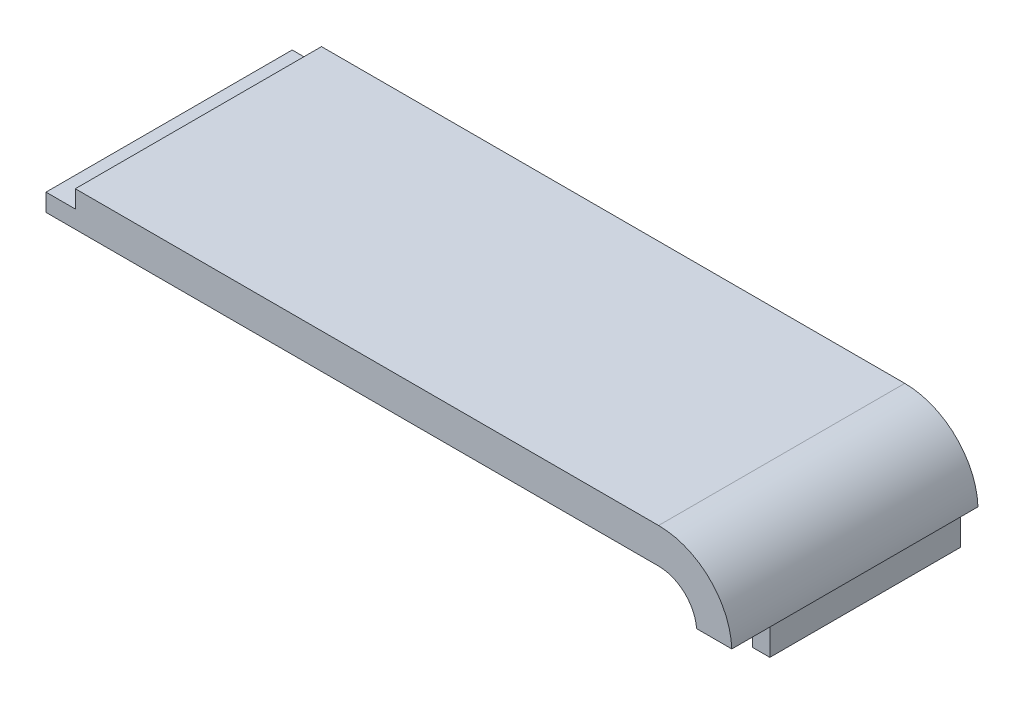
ISO-10303-21;
HEADER;
FILE_DESCRIPTION(('STEP AP214'),'2;1');
FILE_NAME('part.step','',(''),(''),'','','');
FILE_SCHEMA(('AUTOMOTIVE_DESIGN { 1 0 10303 214 1 1 1 1 }'));
ENDSEC;
DATA;
#1=APPLICATION_CONTEXT('core data for automotive mechanical design processes');
#2=APPLICATION_PROTOCOL_DEFINITION('international standard','automotive_design',2000,#1);
#3=PRODUCT_CONTEXT('',#1,'mechanical');
#4=PRODUCT('Part','Part','',(#3));
#5=PRODUCT_RELATED_PRODUCT_CATEGORY('part','',(#4));
#6=PRODUCT_DEFINITION_FORMATION('','',#4);
#7=PRODUCT_DEFINITION_CONTEXT('part definition',#1,'design');
#8=PRODUCT_DEFINITION('design','',#6,#7);
#9=PRODUCT_DEFINITION_SHAPE('','',#8);
#10=(LENGTH_UNIT() NAMED_UNIT(*) SI_UNIT(.MILLI.,.METRE.));
#11=(NAMED_UNIT(*) PLANE_ANGLE_UNIT() SI_UNIT($,.RADIAN.));
#12=(NAMED_UNIT(*) SI_UNIT($,.STERADIAN.) SOLID_ANGLE_UNIT());
#13=UNCERTAINTY_MEASURE_WITH_UNIT(LENGTH_MEASURE(1.E-05),#10,'distance_accuracy_value','');
#14=(GEOMETRIC_REPRESENTATION_CONTEXT(3) GLOBAL_UNCERTAINTY_ASSIGNED_CONTEXT((#13)) GLOBAL_UNIT_ASSIGNED_CONTEXT((#10,
#11,#12)) REPRESENTATION_CONTEXT('',''));
#15=CARTESIAN_POINT('',(0.,0.,0.));
#16=DIRECTION('',(0.,0.,1.));
#17=DIRECTION('',(1.,0.,0.));
#18=AXIS2_PLACEMENT_3D('',#15,#16,#17);
#19=CARTESIAN_POINT('',(21.5136790206361,3.62419354838709,16.8));
#20=DIRECTION('',(0.,1.,0.));
#21=DIRECTION('',(0.,0.,1.));
#22=AXIS2_PLACEMENT_3D('',#19,#20,#21);
#23=PLANE('',#22);
#24=DIRECTION('',(0.,0.,-1.));
#25=VECTOR('',#24,1.);
#26=CARTESIAN_POINT('',(18.1059752999993,3.62419354838709,2.));
#27=LINE('',#26,#25);
#28=CARTESIAN_POINT('',(18.1059752999993,3.62419354838709,2.));
#29=VERTEX_POINT('',#28);
#30=CARTESIAN_POINT('',(18.1059752999993,3.62419354838709,0.));
#31=VERTEX_POINT('',#30);
#32=EDGE_CURVE('E149',#29,#31,#27,.T.);
#33=ORIENTED_EDGE('',*,*,#32,.F.);
#34=DIRECTION('',(1.,0.,0.));
#35=VECTOR('',#34,1.);
#36=CARTESIAN_POINT('',(18.1059752999993,3.62419354838709,2.));
#37=LINE('',#36,#35);
#38=CARTESIAN_POINT('',(21.5136790206361,3.62419354838709,2.));
#39=VERTEX_POINT('',#38);
#40=EDGE_CURVE('E153',#29,#39,#37,.T.);
#41=ORIENTED_EDGE('',*,*,#40,.T.);
#42=DIRECTION('',(0.,0.,-1.));
#43=VECTOR('',#42,1.);
#44=CARTESIAN_POINT('',(21.5136790206361,3.62419354838709,16.8));
#45=LINE('',#44,#43);
#46=CARTESIAN_POINT('',(21.5136790206361,3.62419354838709,16.8));
#47=VERTEX_POINT('',#46);
#48=EDGE_CURVE('E230',#47,#39,#45,.T.);
#49=ORIENTED_EDGE('',*,*,#48,.F.);
#50=DIRECTION('',(1.,0.,0.));
#51=VECTOR('',#50,1.);
#52=CARTESIAN_POINT('',(21.5136790206361,3.62419354838709,16.8));
#53=LINE('',#52,#51);
#54=CARTESIAN_POINT('',(-20.2903225806451,3.62419354838709,16.8));
#55=VERTEX_POINT('',#54);
#56=EDGE_CURVE('E221',#55,#47,#53,.T.);
#57=ORIENTED_EDGE('',*,*,#56,.F.);
#58=DIRECTION('',(0.,0.,1.));
#59=VECTOR('',#58,1.);
#60=CARTESIAN_POINT('',(-20.2903225806451,3.62419354838709,0.));
#61=LINE('',#60,#59);
#62=CARTESIAN_POINT('',(-20.2903225806451,3.62419354838709,0.));
#63=VERTEX_POINT('',#62);
#64=EDGE_CURVE('E177',#63,#55,#61,.T.);
#65=ORIENTED_EDGE('',*,*,#64,.F.);
#66=DIRECTION('',(1.,0.,0.));
#67=VECTOR('',#66,1.);
#68=CARTESIAN_POINT('',(21.5136790206361,3.62419354838709,0.));
#69=LINE('',#68,#67);
#70=EDGE_CURVE('E163',#63,#31,#69,.T.);
#71=ORIENTED_EDGE('',*,*,#70,.T.);
#72=EDGE_LOOP('',(#33,#41,#49,#57,#65,#71));
#73=FACE_BOUND('',#72,.T.);
#74=ADVANCED_FACE('F39',(#73),#23,.F.);
#75=CARTESIAN_POINT('',(-18.2903225806451,6.02419354838709,16.8));
#76=DIRECTION('',(1.,0.,0.));
#77=DIRECTION('',(0.,0.,-1.));
#78=AXIS2_PLACEMENT_3D('',#75,#76,#77);
#79=PLANE('',#78);
#80=DIRECTION('',(0.,0.,-1.));
#81=VECTOR('',#80,1.);
#82=CARTESIAN_POINT('',(-18.2903225806451,4.82419354838709,0.));
#83=LINE('',#82,#81);
#84=CARTESIAN_POINT('',(-18.2903225806451,4.82419354838709,16.8));
#85=VERTEX_POINT('',#84);
#86=CARTESIAN_POINT('',(-18.2903225806451,4.82419354838709,0.));
#87=VERTEX_POINT('',#86);
#88=EDGE_CURVE('E166',#85,#87,#83,.T.);
#89=ORIENTED_EDGE('',*,*,#88,.F.);
#90=DIRECTION('',(0.,-1.,0.));
#91=VECTOR('',#90,1.);
#92=CARTESIAN_POINT('',(-18.2903225806451,6.02419354838709,16.8));
#93=LINE('',#92,#91);
#94=CARTESIAN_POINT('',(-18.2903225806451,6.02419354838709,16.8));
#95=VERTEX_POINT('',#94);
#96=EDGE_CURVE('E235',#95,#85,#93,.T.);
#97=ORIENTED_EDGE('',*,*,#96,.F.);
#98=DIRECTION('',(0.,0.,-1.));
#99=VECTOR('',#98,1.);
#100=CARTESIAN_POINT('',(-18.2903225806451,6.02419354838709,16.8));
#101=LINE('',#100,#99);
#102=CARTESIAN_POINT('',(-18.2903225806451,6.02419354838709,0.));
#103=VERTEX_POINT('',#102);
#104=EDGE_CURVE('E244',#95,#103,#101,.T.);
#105=ORIENTED_EDGE('',*,*,#104,.T.);
#106=DIRECTION('',(0.,-1.,0.));
#107=VECTOR('',#106,1.);
#108=CARTESIAN_POINT('',(-18.2903225806451,6.02419354838709,0.));
#109=LINE('',#108,#107);
#110=EDGE_CURVE('E233',#103,#87,#109,.T.);
#111=ORIENTED_EDGE('',*,*,#110,.T.);
#112=EDGE_LOOP('',(#89,#97,#105,#111));
#113=FACE_BOUND('',#112,.T.);
#114=ADVANCED_FACE('F296',(#113),#79,.F.);
#115=CARTESIAN_POINT('',(0.,0.,16.8));
#116=DIRECTION('',(0.,0.,1.));
#117=DIRECTION('',(1.,0.,0.));
#118=AXIS2_PLACEMENT_3D('',#115,#116,#117);
#119=PLANE('',#118);
#120=ORIENTED_EDGE('',*,*,#56,.T.);
#121=CARTESIAN_POINT('',(21.5136790206361,1.02419354838709,16.8));
#122=DIRECTION('',(0.,0.,-1.));
#123=DIRECTION('',(-1.,0.,0.));
#124=AXIS2_PLACEMENT_3D('',#121,#122,#123);
#125=CIRCLE('',#124,2.6);
#126=CARTESIAN_POINT('',(24.1059752999993,1.22419354838709,16.8));
#127=VERTEX_POINT('',#126);
#128=EDGE_CURVE('E222',#47,#127,#125,.T.);
#129=ORIENTED_EDGE('',*,*,#128,.T.);
#130=DIRECTION('',(1.,0.,0.));
#131=VECTOR('',#130,1.);
#132=CARTESIAN_POINT('',(-18.2903225806451,1.22419354838709,16.8));
#133=LINE('',#132,#131);
#134=CARTESIAN_POINT('',(26.5096774193548,1.22419354838709,16.8));
#135=VERTEX_POINT('',#134);
#136=EDGE_CURVE('E240',#127,#135,#133,.T.);
#137=ORIENTED_EDGE('',*,*,#136,.T.);
#138=CARTESIAN_POINT('',(21.5136790206361,1.02419354838709,16.8));
#139=DIRECTION('',(0.,0.,1.));
#140=DIRECTION('',(1.,0.,0.));
#141=AXIS2_PLACEMENT_3D('',#138,#139,#140);
#142=CIRCLE('',#141,5.);
#143=CARTESIAN_POINT('',(21.5136790206361,6.02419354838709,16.8));
#144=VERTEX_POINT('',#143);
#145=EDGE_CURVE('E256',#135,#144,#142,.T.);
#146=ORIENTED_EDGE('',*,*,#145,.T.);
#147=DIRECTION('',(-1.,0.,0.));
#148=VECTOR('',#147,1.);
#149=CARTESIAN_POINT('',(-18.2903225806451,6.02419354838709,16.8));
#150=LINE('',#149,#148);
#151=EDGE_CURVE('E238',#144,#95,#150,.T.);
#152=ORIENTED_EDGE('',*,*,#151,.T.);
#153=ORIENTED_EDGE('',*,*,#96,.T.);
#154=DIRECTION('',(1.,0.,0.));
#155=VECTOR('',#154,1.);
#156=CARTESIAN_POINT('',(-20.2903225806451,4.82419354838709,16.8));
#157=LINE('',#156,#155);
#158=CARTESIAN_POINT('',(-20.2903225806451,4.82419354838709,16.8));
#159=VERTEX_POINT('',#158);
#160=EDGE_CURVE('E186',#159,#85,#157,.T.);
#161=ORIENTED_EDGE('',*,*,#160,.F.);
#162=DIRECTION('',(0.,1.,0.));
#163=VECTOR('',#162,1.);
#164=CARTESIAN_POINT('',(-20.2903225806451,3.62419354838709,16.8));
#165=LINE('',#164,#163);
#166=EDGE_CURVE('E182',#55,#159,#165,.T.);
#167=ORIENTED_EDGE('',*,*,#166,.F.);
#168=EDGE_LOOP('',(#120,#129,#137,#146,#152,#153,#161,#167));
#169=FACE_BOUND('',#168,.T.);
#170=ADVANCED_FACE('F290',(#169),#119,.T.);
#171=CARTESIAN_POINT('',(0.,0.,0.));
#172=DIRECTION('',(0.,0.,1.));
#173=DIRECTION('',(1.,0.,0.));
#174=AXIS2_PLACEMENT_3D('',#171,#172,#173);
#175=PLANE('',#174);
#176=DIRECTION('',(-1.,0.,0.));
#177=VECTOR('',#176,1.);
#178=CARTESIAN_POINT('',(24.1059752999993,-0.775806451612912,0.));
#179=LINE('',#178,#177);
#180=CARTESIAN_POINT('',(24.1059752999993,-0.775806451612912,0.));
#181=VERTEX_POINT('',#180);
#182=CARTESIAN_POINT('',(20.1059752999993,-0.775806451612912,0.));
#183=VERTEX_POINT('',#182);
#184=EDGE_CURVE('E270',#181,#183,#179,.T.);
#185=ORIENTED_EDGE('',*,*,#184,.T.);
#186=CARTESIAN_POINT('',(20.1059752999993,1.22419354838709,0.));
#187=DIRECTION('',(0.,0.,1.));
#188=DIRECTION('',(1.,0.,0.));
#189=AXIS2_PLACEMENT_3D('',#186,#187,#188);
#190=CIRCLE('',#189,2.);
#191=CARTESIAN_POINT('',(18.1059752999993,1.22419354838709,0.));
#192=VERTEX_POINT('',#191);
#193=EDGE_CURVE('E63',#183,#192,#190,.F.);
#194=ORIENTED_EDGE('',*,*,#193,.T.);
#195=DIRECTION('',(0.,1.,0.));
#196=VECTOR('',#195,1.);
#197=CARTESIAN_POINT('',(18.1059752999993,-0.775806451612912,0.));
#198=LINE('',#197,#196);
#199=EDGE_CURVE('E273',#192,#31,#198,.T.);
#200=ORIENTED_EDGE('',*,*,#199,.T.);
#201=ORIENTED_EDGE('',*,*,#70,.F.);
#202=DIRECTION('',(0.,-1.,0.));
#203=VECTOR('',#202,1.);
#204=CARTESIAN_POINT('',(-20.2903225806451,3.62419354838709,0.));
#205=LINE('',#204,#203);
#206=CARTESIAN_POINT('',(-20.2903225806451,4.82419354838709,0.));
#207=VERTEX_POINT('',#206);
#208=EDGE_CURVE('E171',#207,#63,#205,.T.);
#209=ORIENTED_EDGE('',*,*,#208,.F.);
#210=DIRECTION('',(1.,0.,0.));
#211=VECTOR('',#210,1.);
#212=CARTESIAN_POINT('',(-20.2903225806451,4.82419354838709,0.));
#213=LINE('',#212,#211);
#214=EDGE_CURVE('E183',#207,#87,#213,.T.);
#215=ORIENTED_EDGE('',*,*,#214,.T.);
#216=ORIENTED_EDGE('',*,*,#110,.F.);
#217=DIRECTION('',(-1.,0.,0.));
#218=VECTOR('',#217,1.);
#219=CARTESIAN_POINT('',(-18.2903225806451,6.02419354838709,0.));
#220=LINE('',#219,#218);
#221=CARTESIAN_POINT('',(21.5136790206361,6.02419354838709,0.));
#222=VERTEX_POINT('',#221);
#223=EDGE_CURVE('E236',#222,#103,#220,.T.);
#224=ORIENTED_EDGE('',*,*,#223,.F.);
#225=CARTESIAN_POINT('',(21.5136790206361,1.02419354838709,0.));
#226=DIRECTION('',(0.,0.,1.));
#227=DIRECTION('',(1.,0.,0.));
#228=AXIS2_PLACEMENT_3D('',#225,#226,#227);
#229=CIRCLE('',#228,5.);
#230=CARTESIAN_POINT('',(26.5096774193548,1.22419354838709,0.));
#231=VERTEX_POINT('',#230);
#232=EDGE_CURVE('E254',#222,#231,#229,.F.);
#233=ORIENTED_EDGE('',*,*,#232,.T.);
#234=DIRECTION('',(1.,0.,0.));
#235=VECTOR('',#234,1.);
#236=CARTESIAN_POINT('',(-18.2903225806451,1.22419354838709,0.));
#237=LINE('',#236,#235);
#238=CARTESIAN_POINT('',(25.3059752999993,1.22419354838709,0.));
#239=VERTEX_POINT('',#238);
#240=EDGE_CURVE('E245',#239,#231,#237,.T.);
#241=ORIENTED_EDGE('',*,*,#240,.F.);
#242=DIRECTION('',(0.,1.,0.));
#243=VECTOR('',#242,1.);
#244=CARTESIAN_POINT('',(25.3059752999993,-1.77580645161291,0.));
#245=LINE('',#244,#243);
#246=CARTESIAN_POINT('',(25.3059752999993,-1.77580645161291,0.));
#247=VERTEX_POINT('',#246);
#248=EDGE_CURVE('E217',#247,#239,#245,.T.);
#249=ORIENTED_EDGE('',*,*,#248,.F.);
#250=DIRECTION('',(1.,0.,0.));
#251=VECTOR('',#250,1.);
#252=CARTESIAN_POINT('',(24.1059752999993,-1.77580645161291,0.));
#253=LINE('',#252,#251);
#254=CARTESIAN_POINT('',(24.1059752999993,-1.77580645161291,0.));
#255=VERTEX_POINT('',#254);
#256=EDGE_CURVE('E203',#255,#247,#253,.T.);
#257=ORIENTED_EDGE('',*,*,#256,.F.);
#258=DIRECTION('',(0.,1.,0.));
#259=VECTOR('',#258,1.);
#260=CARTESIAN_POINT('',(24.1059752999993,-1.77580645161291,0.));
#261=LINE('',#260,#259);
#262=EDGE_CURVE('E214',#255,#181,#261,.T.);
#263=ORIENTED_EDGE('',*,*,#262,.T.);
#264=EDGE_LOOP('',(#185,#194,#200,#201,#209,#215,#216,#224,#233,#241,#249,#257,#263));
#265=FACE_BOUND('',#264,.T.);
#266=CARTESIAN_POINT('',(21.5136790206361,1.02419354838709,0.));
#267=DIRECTION('',(0.,0.,-1.));
#268=DIRECTION('',(-1.,0.,0.));
#269=AXIS2_PLACEMENT_3D('',#266,#267,#268);
#270=CIRCLE('',#269,1.);
#271=CARTESIAN_POINT('',(20.5136790206361,1.02419354838709,0.));
#272=VERTEX_POINT('',#271);
#273=EDGE_CURVE('E279',#272,#272,#270,.T.);
#274=ORIENTED_EDGE('',*,*,#273,.F.);
#275=EDGE_LOOP('',(#274));
#276=FACE_BOUND('',#275,.T.);
#277=ADVANCED_FACE('F269',(#265,#276),#175,.F.);
#278=CARTESIAN_POINT('',(-18.2903225806451,1.22419354838709,16.8));
#279=DIRECTION('',(0.,1.,0.));
#280=DIRECTION('',(0.,0.,1.));
#281=AXIS2_PLACEMENT_3D('',#278,#279,#280);
#282=PLANE('',#281);
#283=DIRECTION('',(0.,0.,-1.));
#284=VECTOR('',#283,1.);
#285=CARTESIAN_POINT('',(24.1059752999993,1.22419354838709,16.8));
#286=LINE('',#285,#284);
#287=CARTESIAN_POINT('',(24.1059752999993,1.22419354838709,13.));
#288=VERTEX_POINT('',#287);
#289=EDGE_CURVE('E229',#127,#288,#286,.T.);
#290=ORIENTED_EDGE('',*,*,#289,.T.);
#291=DIRECTION('',(1.,0.,0.));
#292=VECTOR('',#291,1.);
#293=CARTESIAN_POINT('',(24.1059752999993,1.22419354838709,13.));
#294=LINE('',#293,#292);
#295=CARTESIAN_POINT('',(25.3059752999993,1.22419354838709,13.));
#296=VERTEX_POINT('',#295);
#297=EDGE_CURVE('E192',#288,#296,#294,.T.);
#298=ORIENTED_EDGE('',*,*,#297,.T.);
#299=DIRECTION('',(0.,0.,-1.));
#300=VECTOR('',#299,1.);
#301=CARTESIAN_POINT('',(25.3059752999993,1.22419354838709,13.));
#302=LINE('',#301,#300);
#303=EDGE_CURVE('E208',#296,#239,#302,.T.);
#304=ORIENTED_EDGE('',*,*,#303,.T.);
#305=ORIENTED_EDGE('',*,*,#240,.T.);
#306=DIRECTION('',(0.,0.,-1.));
#307=VECTOR('',#306,1.);
#308=CARTESIAN_POINT('',(26.5096774193548,1.22419354838709,16.8));
#309=LINE('',#308,#307);
#310=EDGE_CURVE('E250',#135,#231,#309,.T.);
#311=ORIENTED_EDGE('',*,*,#310,.F.);
#312=ORIENTED_EDGE('',*,*,#136,.F.);
#313=EDGE_LOOP('',(#290,#298,#304,#305,#311,#312));
#314=FACE_BOUND('',#313,.T.);
#315=ADVANCED_FACE('F287',(#314),#282,.F.);
#316=CARTESIAN_POINT('',(-18.2903225806451,6.02419354838709,16.8));
#317=DIRECTION('',(0.,-1.,0.));
#318=DIRECTION('',(0.,0.,-1.));
#319=AXIS2_PLACEMENT_3D('',#316,#317,#318);
#320=PLANE('',#319);
#321=ORIENTED_EDGE('',*,*,#151,.F.);
#322=DIRECTION('',(0.,0.,-1.));
#323=VECTOR('',#322,1.);
#324=CARTESIAN_POINT('',(21.5136790206361,6.02419354838709,16.8));
#325=LINE('',#324,#323);
#326=EDGE_CURVE('E252',#144,#222,#325,.T.);
#327=ORIENTED_EDGE('',*,*,#326,.T.);
#328=ORIENTED_EDGE('',*,*,#223,.T.);
#329=ORIENTED_EDGE('',*,*,#104,.F.);
#330=EDGE_LOOP('',(#321,#327,#328,#329));
#331=FACE_BOUND('',#330,.T.);
#332=ADVANCED_FACE('F298',(#331),#320,.F.);
#333=CARTESIAN_POINT('',(21.5136790206361,1.02419354838709,16.8));
#334=DIRECTION('',(0.,0.,-1.));
#335=DIRECTION('',(-1.,0.,0.));
#336=AXIS2_PLACEMENT_3D('',#333,#334,#335);
#337=CYLINDRICAL_SURFACE('',#336,5.);
#338=ORIENTED_EDGE('',*,*,#145,.F.);
#339=ORIENTED_EDGE('',*,*,#310,.T.);
#340=ORIENTED_EDGE('',*,*,#232,.F.);
#341=ORIENTED_EDGE('',*,*,#326,.F.);
#342=EDGE_LOOP('',(#338,#339,#340,#341));
#343=FACE_BOUND('',#342,.T.);
#344=ADVANCED_FACE('F318',(#343),#337,.T.);
#345=CARTESIAN_POINT('',(21.5136790206361,1.02419354838709,16.8));
#346=DIRECTION('',(0.,0.,-1.));
#347=DIRECTION('',(-1.,0.,0.));
#348=AXIS2_PLACEMENT_3D('',#345,#346,#347);
#349=CYLINDRICAL_SURFACE('',#348,2.6);
#350=ORIENTED_EDGE('',*,*,#48,.T.);
#351=CARTESIAN_POINT('',(21.5136790206361,1.02419354838709,2.));
#352=DIRECTION('',(0.,0.,-1.));
#353=DIRECTION('',(-1.,0.,0.));
#354=AXIS2_PLACEMENT_3D('',#351,#352,#353);
#355=CIRCLE('',#354,2.6);
#356=CARTESIAN_POINT('',(24.1059752999993,1.22419354838709,2.));
#357=VERTEX_POINT('',#356);
#358=EDGE_CURVE('E157',#39,#357,#355,.T.);
#359=ORIENTED_EDGE('',*,*,#358,.T.);
#360=DIRECTION('',(0.,0.,-1.));
#361=VECTOR('',#360,1.);
#362=CARTESIAN_POINT('',(24.1059752999993,1.22419354838709,13.));
#363=LINE('',#362,#361);
#364=EDGE_CURVE('E196',#288,#357,#363,.T.);
#365=ORIENTED_EDGE('',*,*,#364,.F.);
#366=ORIENTED_EDGE('',*,*,#289,.F.);
#367=ORIENTED_EDGE('',*,*,#128,.F.);
#368=EDGE_LOOP('',(#350,#359,#365,#366,#367));
#369=FACE_BOUND('',#368,.T.);
#370=ADVANCED_FACE('F320',(#369),#349,.F.);
#371=CARTESIAN_POINT('',(24.1059752999993,-1.77580645161291,13.));
#372=DIRECTION('',(0.,0.,1.));
#373=DIRECTION('',(1.,0.,0.));
#374=AXIS2_PLACEMENT_3D('',#371,#372,#373);
#375=PLANE('',#374);
#376=ORIENTED_EDGE('',*,*,#297,.F.);
#377=DIRECTION('',(0.,1.,0.));
#378=VECTOR('',#377,1.);
#379=CARTESIAN_POINT('',(24.1059752999993,-1.77580645161291,13.));
#380=LINE('',#379,#378);
#381=CARTESIAN_POINT('',(24.1059752999993,-1.77580645161291,13.));
#382=VERTEX_POINT('',#381);
#383=EDGE_CURVE('E213',#382,#288,#380,.T.);
#384=ORIENTED_EDGE('',*,*,#383,.F.);
#385=DIRECTION('',(1.,0.,0.));
#386=VECTOR('',#385,1.);
#387=CARTESIAN_POINT('',(24.1059752999993,-1.77580645161291,13.));
#388=LINE('',#387,#386);
#389=CARTESIAN_POINT('',(25.3059752999993,-1.77580645161291,13.));
#390=VERTEX_POINT('',#389);
#391=EDGE_CURVE('E195',#382,#390,#388,.T.);
#392=ORIENTED_EDGE('',*,*,#391,.T.);
#393=DIRECTION('',(0.,1.,0.));
#394=VECTOR('',#393,1.);
#395=CARTESIAN_POINT('',(25.3059752999993,-1.77580645161291,13.));
#396=LINE('',#395,#394);
#397=EDGE_CURVE('E202',#390,#296,#396,.T.);
#398=ORIENTED_EDGE('',*,*,#397,.T.);
#399=EDGE_LOOP('',(#376,#384,#392,#398));
#400=FACE_BOUND('',#399,.T.);
#401=ADVANCED_FACE('F312',(#400),#375,.T.);
#402=CARTESIAN_POINT('',(24.1059752999993,-1.77580645161291,13.));
#403=DIRECTION('',(1.,0.,0.));
#404=DIRECTION('',(0.,0.,-1.));
#405=AXIS2_PLACEMENT_3D('',#402,#403,#404);
#406=PLANE('',#405);
#407=ORIENTED_EDGE('',*,*,#364,.T.);
#408=DIRECTION('',(0.,-1.,0.));
#409=VECTOR('',#408,1.);
#410=CARTESIAN_POINT('',(24.1059752999993,-0.775806451612912,2.));
#411=LINE('',#410,#409);
#412=CARTESIAN_POINT('',(24.1059752999993,-0.775806451612912,2.));
#413=VERTEX_POINT('',#412);
#414=EDGE_CURVE('E167',#357,#413,#411,.T.);
#415=ORIENTED_EDGE('',*,*,#414,.T.);
#416=DIRECTION('',(0.,0.,-1.));
#417=VECTOR('',#416,1.);
#418=CARTESIAN_POINT('',(24.1059752999993,-0.775806451612912,2.));
#419=LINE('',#418,#417);
#420=EDGE_CURVE('E164',#413,#181,#419,.T.);
#421=ORIENTED_EDGE('',*,*,#420,.T.);
#422=ORIENTED_EDGE('',*,*,#262,.F.);
#423=DIRECTION('',(0.,0.,-1.));
#424=VECTOR('',#423,1.);
#425=CARTESIAN_POINT('',(24.1059752999993,-1.77580645161291,13.));
#426=LINE('',#425,#424);
#427=EDGE_CURVE('E201',#382,#255,#426,.T.);
#428=ORIENTED_EDGE('',*,*,#427,.F.);
#429=ORIENTED_EDGE('',*,*,#383,.T.);
#430=EDGE_LOOP('',(#407,#415,#421,#422,#428,#429));
#431=FACE_BOUND('',#430,.T.);
#432=ADVANCED_FACE('F322',(#431),#406,.F.);
#433=CARTESIAN_POINT('',(25.3059752999993,-1.77580645161291,13.));
#434=DIRECTION('',(1.,0.,0.));
#435=DIRECTION('',(0.,0.,-1.));
#436=AXIS2_PLACEMENT_3D('',#433,#434,#435);
#437=PLANE('',#436);
#438=ORIENTED_EDGE('',*,*,#303,.F.);
#439=ORIENTED_EDGE('',*,*,#397,.F.);
#440=DIRECTION('',(0.,0.,-1.));
#441=VECTOR('',#440,1.);
#442=CARTESIAN_POINT('',(25.3059752999993,-1.77580645161291,13.));
#443=LINE('',#442,#441);
#444=EDGE_CURVE('E197',#390,#247,#443,.T.);
#445=ORIENTED_EDGE('',*,*,#444,.T.);
#446=ORIENTED_EDGE('',*,*,#248,.T.);
#447=EDGE_LOOP('',(#438,#439,#445,#446));
#448=FACE_BOUND('',#447,.T.);
#449=ADVANCED_FACE('F358',(#448),#437,.T.);
#450=CARTESIAN_POINT('',(0.,-1.77580645161291,0.));
#451=DIRECTION('',(0.,1.,0.));
#452=DIRECTION('',(0.,0.,1.));
#453=AXIS2_PLACEMENT_3D('',#450,#451,#452);
#454=PLANE('',#453);
#455=ORIENTED_EDGE('',*,*,#391,.F.);
#456=ORIENTED_EDGE('',*,*,#427,.T.);
#457=ORIENTED_EDGE('',*,*,#256,.T.);
#458=ORIENTED_EDGE('',*,*,#444,.F.);
#459=EDGE_LOOP('',(#455,#456,#457,#458));
#460=FACE_BOUND('',#459,.T.);
#461=ADVANCED_FACE('F356',(#460),#454,.F.);
#462=CARTESIAN_POINT('',(-20.2903225806451,4.82419354838709,0.));
#463=DIRECTION('',(0.,-1.,0.));
#464=DIRECTION('',(0.,0.,-1.));
#465=AXIS2_PLACEMENT_3D('',#462,#463,#464);
#466=PLANE('',#465);
#467=ORIENTED_EDGE('',*,*,#88,.T.);
#468=ORIENTED_EDGE('',*,*,#214,.F.);
#469=DIRECTION('',(0.,0.,-1.));
#470=VECTOR('',#469,1.);
#471=CARTESIAN_POINT('',(-20.2903225806451,4.82419354838709,0.));
#472=LINE('',#471,#470);
#473=EDGE_CURVE('E181',#159,#207,#472,.T.);
#474=ORIENTED_EDGE('',*,*,#473,.F.);
#475=ORIENTED_EDGE('',*,*,#160,.T.);
#476=EDGE_LOOP('',(#467,#468,#474,#475));
#477=FACE_BOUND('',#476,.T.);
#478=ADVANCED_FACE('F340',(#477),#466,.F.);
#479=CARTESIAN_POINT('',(-20.2903225806451,0.,0.));
#480=DIRECTION('',(1.,0.,0.));
#481=DIRECTION('',(0.,0.,-1.));
#482=AXIS2_PLACEMENT_3D('',#479,#480,#481);
#483=PLANE('',#482);
#484=ORIENTED_EDGE('',*,*,#208,.T.);
#485=ORIENTED_EDGE('',*,*,#64,.T.);
#486=ORIENTED_EDGE('',*,*,#166,.T.);
#487=ORIENTED_EDGE('',*,*,#473,.T.);
#488=EDGE_LOOP('',(#484,#485,#486,#487));
#489=FACE_BOUND('',#488,.T.);
#490=ADVANCED_FACE('F335',(#489),#483,.F.);
#491=CARTESIAN_POINT('',(24.1059752999993,-0.775806451612912,2.));
#492=DIRECTION('',(0.,-1.,0.));
#493=DIRECTION('',(0.,0.,-1.));
#494=AXIS2_PLACEMENT_3D('',#491,#492,#493);
#495=PLANE('',#494);
#496=DIRECTION('',(-1.,0.,0.));
#497=VECTOR('',#496,1.);
#498=CARTESIAN_POINT('',(24.1059752999993,-0.775806451612912,2.));
#499=LINE('',#498,#497);
#500=CARTESIAN_POINT('',(20.1059752999993,-0.775806451612912,2.));
#501=VERTEX_POINT('',#500);
#502=EDGE_CURVE('E152',#413,#501,#499,.T.);
#503=ORIENTED_EDGE('',*,*,#502,.T.);
#504=DIRECTION('',(0.,0.,-1.));
#505=VECTOR('',#504,1.);
#506=CARTESIAN_POINT('',(20.1059752999993,-0.775806451612912,2.));
#507=LINE('',#506,#505);
#508=EDGE_CURVE('E257',#501,#183,#507,.T.);
#509=ORIENTED_EDGE('',*,*,#508,.T.);
#510=ORIENTED_EDGE('',*,*,#184,.F.);
#511=ORIENTED_EDGE('',*,*,#420,.F.);
#512=EDGE_LOOP('',(#503,#509,#510,#511));
#513=FACE_BOUND('',#512,.T.);
#514=ADVANCED_FACE('F266',(#513),#495,.T.);
#515=CARTESIAN_POINT('',(18.1059752999993,-0.775806451612912,2.));
#516=DIRECTION('',(-1.,0.,0.));
#517=DIRECTION('',(0.,0.,1.));
#518=AXIS2_PLACEMENT_3D('',#515,#516,#517);
#519=PLANE('',#518);
#520=ORIENTED_EDGE('',*,*,#199,.F.);
#521=DIRECTION('',(0.,0.,-1.));
#522=VECTOR('',#521,1.);
#523=CARTESIAN_POINT('',(18.1059752999993,1.22419354838709,2.));
#524=LINE('',#523,#522);
#525=CARTESIAN_POINT('',(18.1059752999993,1.22419354838709,2.));
#526=VERTEX_POINT('',#525);
#527=EDGE_CURVE('E50',#192,#526,#524,.F.);
#528=ORIENTED_EDGE('',*,*,#527,.T.);
#529=DIRECTION('',(0.,1.,0.));
#530=VECTOR('',#529,1.);
#531=CARTESIAN_POINT('',(18.1059752999993,-0.775806451612912,2.));
#532=LINE('',#531,#530);
#533=EDGE_CURVE('E144',#526,#29,#532,.T.);
#534=ORIENTED_EDGE('',*,*,#533,.T.);
#535=ORIENTED_EDGE('',*,*,#32,.T.);
#536=EDGE_LOOP('',(#520,#528,#534,#535));
#537=FACE_BOUND('',#536,.T.);
#538=ADVANCED_FACE('F150',(#537),#519,.T.);
#539=CARTESIAN_POINT('',(21.5136790206361,1.02419354838709,2.));
#540=DIRECTION('',(0.,0.,-1.));
#541=DIRECTION('',(-1.,0.,0.));
#542=AXIS2_PLACEMENT_3D('',#539,#540,#541);
#543=PLANE('',#542);
#544=CARTESIAN_POINT('',(21.5136790206361,1.02419354838709,2.));
#545=DIRECTION('',(0.,0.,-1.));
#546=DIRECTION('',(-1.,0.,0.));
#547=AXIS2_PLACEMENT_3D('',#544,#545,#546);
#548=CIRCLE('',#547,1.);
#549=CARTESIAN_POINT('',(20.5136790206361,1.02419354838709,2.));
#550=VERTEX_POINT('',#549);
#551=EDGE_CURVE('E274',#550,#550,#548,.T.);
#552=ORIENTED_EDGE('',*,*,#551,.T.);
#553=EDGE_LOOP('',(#552));
#554=FACE_BOUND('',#553,.T.);
#555=ORIENTED_EDGE('',*,*,#533,.F.);
#556=CARTESIAN_POINT('',(20.1059752999993,1.22419354838709,2.));
#557=DIRECTION('',(0.,0.,-1.));
#558=DIRECTION('',(-1.,0.,0.));
#559=AXIS2_PLACEMENT_3D('',#556,#557,#558);
#560=CIRCLE('',#559,2.);
#561=EDGE_CURVE('E11',#526,#501,#560,.F.);
#562=ORIENTED_EDGE('',*,*,#561,.T.);
#563=ORIENTED_EDGE('',*,*,#502,.F.);
#564=ORIENTED_EDGE('',*,*,#414,.F.);
#565=ORIENTED_EDGE('',*,*,#358,.F.);
#566=ORIENTED_EDGE('',*,*,#40,.F.);
#567=EDGE_LOOP('',(#555,#562,#563,#564,#565,#566));
#568=FACE_BOUND('',#567,.T.);
#569=ADVANCED_FACE('F160',(#554,#568),#543,.F.);
#570=CARTESIAN_POINT('',(21.5136790206361,1.02419354838709,2.));
#571=DIRECTION('',(0.,0.,-1.));
#572=DIRECTION('',(-1.,0.,0.));
#573=AXIS2_PLACEMENT_3D('',#570,#571,#572);
#574=CYLINDRICAL_SURFACE('',#573,1.);
#575=ORIENTED_EDGE('',*,*,#551,.F.);
#576=EDGE_LOOP('',(#575));
#577=FACE_BOUND('',#576,.T.);
#578=ORIENTED_EDGE('',*,*,#273,.T.);
#579=EDGE_LOOP('',(#578));
#580=FACE_BOUND('',#579,.T.);
#581=ADVANCED_FACE('F288',(#577,#580),#574,.F.);
#582=CARTESIAN_POINT('',(20.1059752999993,1.22419354838709,2.));
#583=DIRECTION('',(0.,0.,-1.));
#584=DIRECTION('',(-1.,0.,0.));
#585=AXIS2_PLACEMENT_3D('',#582,#583,#584);
#586=CYLINDRICAL_SURFACE('',#585,2.);
#587=ORIENTED_EDGE('',*,*,#561,.F.);
#588=ORIENTED_EDGE('',*,*,#527,.F.);
#589=ORIENTED_EDGE('',*,*,#193,.F.);
#590=ORIENTED_EDGE('',*,*,#508,.F.);
#591=EDGE_LOOP('',(#587,#588,#589,#590));
#592=FACE_BOUND('',#591,.T.);
#593=ADVANCED_FACE('F41',(#592),#586,.T.);
#594=CLOSED_SHELL('',(#74,#114,#170,#277,#315,#332,#344,#370,#401,#432,#449,#461,#478,#490,#514,
#538,#569,#581,#593));
#595=MANIFOLD_SOLID_BREP('B2',#594);
#596=ADVANCED_BREP_SHAPE_REPRESENTATION('',(#18,#595),#14);
#597=SHAPE_DEFINITION_REPRESENTATION(#9,#596);
ENDSEC;
END-ISO-10303-21;
